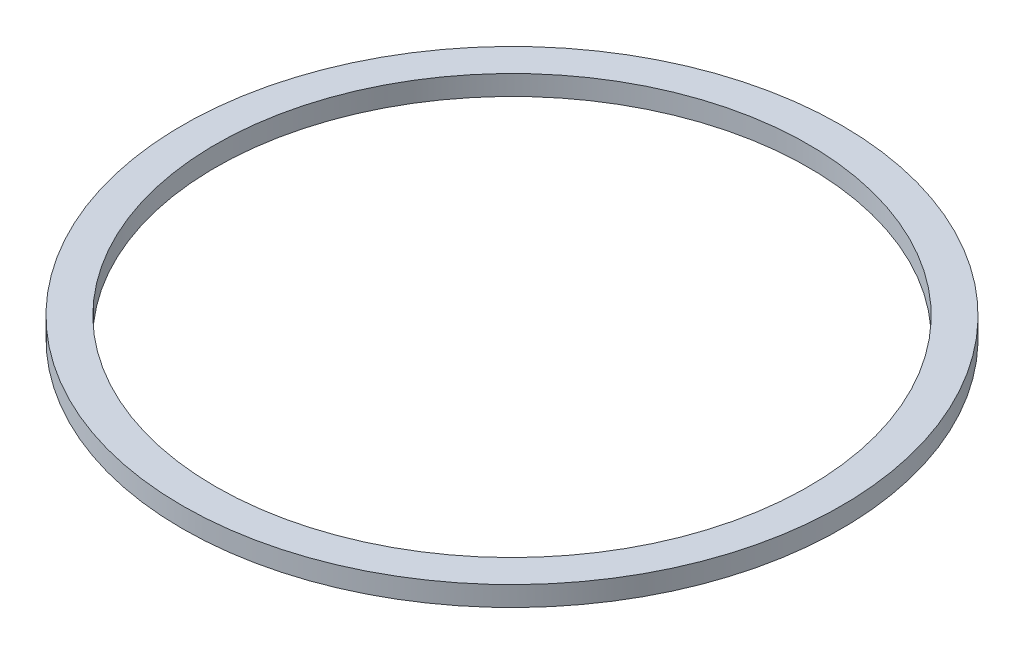
ISO-10303-21;
HEADER;
FILE_DESCRIPTION(('STEP AP214'),'2;1');
FILE_NAME('part.step','',(''),(''),'','','');
FILE_SCHEMA(('AUTOMOTIVE_DESIGN { 1 0 10303 214 1 1 1 1 }'));
ENDSEC;
DATA;
#1=APPLICATION_CONTEXT('core data for automotive mechanical design processes');
#2=APPLICATION_PROTOCOL_DEFINITION('international standard','automotive_design',2000,#1);
#3=PRODUCT_CONTEXT('',#1,'mechanical');
#4=PRODUCT('Part','Part','',(#3));
#5=PRODUCT_RELATED_PRODUCT_CATEGORY('part','',(#4));
#6=PRODUCT_DEFINITION_FORMATION('','',#4);
#7=PRODUCT_DEFINITION_CONTEXT('part definition',#1,'design');
#8=PRODUCT_DEFINITION('design','',#6,#7);
#9=PRODUCT_DEFINITION_SHAPE('','',#8);
#10=(LENGTH_UNIT() NAMED_UNIT(*) SI_UNIT(.MILLI.,.METRE.));
#11=(NAMED_UNIT(*) PLANE_ANGLE_UNIT() SI_UNIT($,.RADIAN.));
#12=(NAMED_UNIT(*) SI_UNIT($,.STERADIAN.) SOLID_ANGLE_UNIT());
#13=UNCERTAINTY_MEASURE_WITH_UNIT(LENGTH_MEASURE(1.E-05),#10,'distance_accuracy_value','');
#14=(GEOMETRIC_REPRESENTATION_CONTEXT(3) GLOBAL_UNCERTAINTY_ASSIGNED_CONTEXT((#13)) GLOBAL_UNIT_ASSIGNED_CONTEXT((#10,
#11,#12)) REPRESENTATION_CONTEXT('',''));
#15=CARTESIAN_POINT('',(0.,0.,0.));
#16=DIRECTION('',(0.,0.,1.));
#17=DIRECTION('',(1.,0.,0.));
#18=AXIS2_PLACEMENT_3D('',#15,#16,#17);
#19=CARTESIAN_POINT('',(0.,600.,0.));
#20=DIRECTION('',(0.,1.,0.));
#21=DIRECTION('',(0.,0.,1.));
#22=AXIS2_PLACEMENT_3D('',#19,#20,#21);
#23=PLANE('',#22);
#24=CARTESIAN_POINT('',(0.,600.,0.));
#25=DIRECTION('',(0.,1.,0.));
#26=DIRECTION('',(0.,0.,1.));
#27=AXIS2_PLACEMENT_3D('',#24,#25,#26);
#28=CIRCLE('',#27,9945.);
#29=CARTESIAN_POINT('',(0.,600.,9945.));
#30=VERTEX_POINT('',#29);
#31=EDGE_CURVE('E10',#30,#30,#28,.T.);
#32=ORIENTED_EDGE('',*,*,#31,.T.);
#33=EDGE_LOOP('',(#32));
#34=FACE_BOUND('',#33,.T.);
#35=CARTESIAN_POINT('',(0.,600.,0.));
#36=DIRECTION('',(0.,1.,0.));
#37=DIRECTION('',(0.,0.,1.));
#38=AXIS2_PLACEMENT_3D('',#35,#36,#37);
#39=CIRCLE('',#38,8945.);
#40=CARTESIAN_POINT('',(0.,600.,8945.));
#41=VERTEX_POINT('',#40);
#42=EDGE_CURVE('E52',#41,#41,#39,.T.);
#43=ORIENTED_EDGE('',*,*,#42,.F.);
#44=EDGE_LOOP('',(#43));
#45=FACE_BOUND('',#44,.T.);
#46=ADVANCED_FACE('F41',(#34,#45),#23,.T.);
#47=CARTESIAN_POINT('',(0.,0.,0.));
#48=DIRECTION('',(0.,1.,0.));
#49=DIRECTION('',(0.,0.,1.));
#50=AXIS2_PLACEMENT_3D('',#47,#48,#49);
#51=PLANE('',#50);
#52=CARTESIAN_POINT('',(0.,0.,0.));
#53=DIRECTION('',(0.,1.,0.));
#54=DIRECTION('',(0.,0.,1.));
#55=AXIS2_PLACEMENT_3D('',#52,#53,#54);
#56=CIRCLE('',#55,9945.);
#57=CARTESIAN_POINT('',(0.,0.,9945.));
#58=VERTEX_POINT('',#57);
#59=EDGE_CURVE('E45',#58,#58,#56,.T.);
#60=ORIENTED_EDGE('',*,*,#59,.F.);
#61=EDGE_LOOP('',(#60));
#62=FACE_BOUND('',#61,.T.);
#63=CARTESIAN_POINT('',(0.,0.,0.));
#64=DIRECTION('',(0.,1.,0.));
#65=DIRECTION('',(0.,0.,1.));
#66=AXIS2_PLACEMENT_3D('',#63,#64,#65);
#67=CIRCLE('',#66,8945.);
#68=CARTESIAN_POINT('',(0.,0.,8945.));
#69=VERTEX_POINT('',#68);
#70=EDGE_CURVE('E54',#69,#69,#67,.T.);
#71=ORIENTED_EDGE('',*,*,#70,.T.);
#72=EDGE_LOOP('',(#71));
#73=FACE_BOUND('',#72,.T.);
#74=ADVANCED_FACE('F64',(#62,#73),#51,.F.);
#75=CARTESIAN_POINT('',(0.,600.,0.));
#76=DIRECTION('',(0.,-1.,0.));
#77=DIRECTION('',(0.,0.,-1.));
#78=AXIS2_PLACEMENT_3D('',#75,#76,#77);
#79=CYLINDRICAL_SURFACE('',#78,9945.);
#80=ORIENTED_EDGE('',*,*,#31,.F.);
#81=EDGE_LOOP('',(#80));
#82=FACE_BOUND('',#81,.T.);
#83=ORIENTED_EDGE('',*,*,#59,.T.);
#84=EDGE_LOOP('',(#83));
#85=FACE_BOUND('',#84,.T.);
#86=ADVANCED_FACE('F43',(#82,#85),#79,.T.);
#87=CARTESIAN_POINT('',(0.,600.,0.));
#88=DIRECTION('',(0.,-1.,0.));
#89=DIRECTION('',(0.,0.,-1.));
#90=AXIS2_PLACEMENT_3D('',#87,#88,#89);
#91=CYLINDRICAL_SURFACE('',#90,8945.);
#92=ORIENTED_EDGE('',*,*,#42,.T.);
#93=EDGE_LOOP('',(#92));
#94=FACE_BOUND('',#93,.T.);
#95=ORIENTED_EDGE('',*,*,#70,.F.);
#96=EDGE_LOOP('',(#95));
#97=FACE_BOUND('',#96,.T.);
#98=ADVANCED_FACE('F60',(#94,#97),#91,.F.);
#99=CLOSED_SHELL('',(#46,#74,#86,#98));
#100=MANIFOLD_SOLID_BREP('B2',#99);
#101=ADVANCED_BREP_SHAPE_REPRESENTATION('',(#18,#100),#14);
#102=SHAPE_DEFINITION_REPRESENTATION(#9,#101);
ENDSEC;
END-ISO-10303-21;
